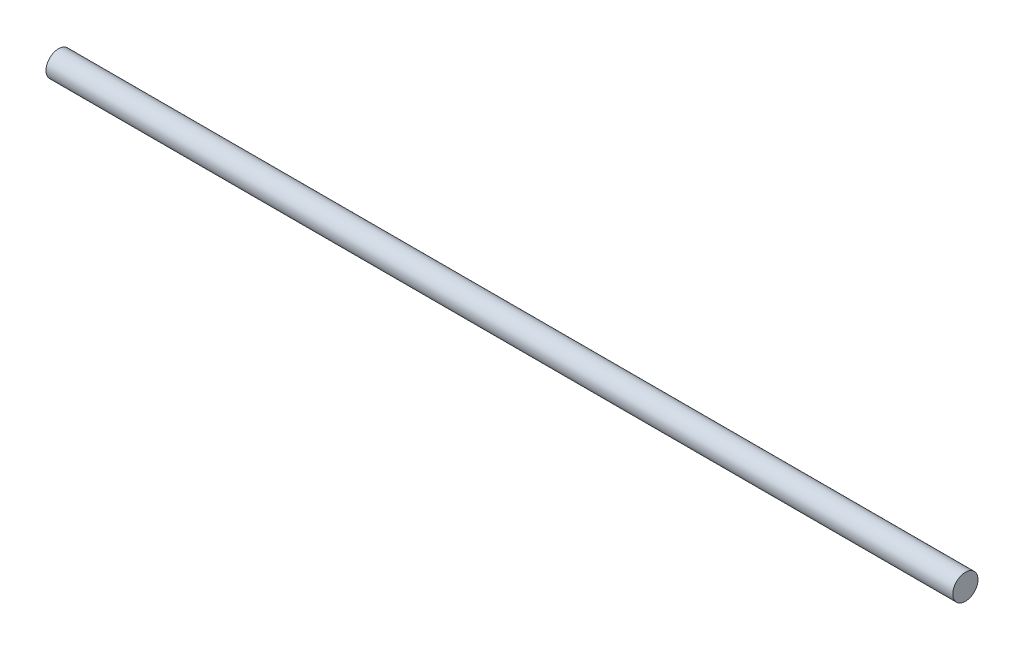
ISO-10303-21;
HEADER;
FILE_DESCRIPTION(('STEP AP214'),'2;1');
FILE_NAME('part.step','',(''),(''),'','','');
FILE_SCHEMA(('AUTOMOTIVE_DESIGN { 1 0 10303 214 1 1 1 1 }'));
ENDSEC;
DATA;
#1=APPLICATION_CONTEXT('core data for automotive mechanical design processes');
#2=APPLICATION_PROTOCOL_DEFINITION('international standard','automotive_design',2000,#1);
#3=PRODUCT_CONTEXT('',#1,'mechanical');
#4=PRODUCT('Part','Part','',(#3));
#5=PRODUCT_RELATED_PRODUCT_CATEGORY('part','',(#4));
#6=PRODUCT_DEFINITION_FORMATION('','',#4);
#7=PRODUCT_DEFINITION_CONTEXT('part definition',#1,'design');
#8=PRODUCT_DEFINITION('design','',#6,#7);
#9=PRODUCT_DEFINITION_SHAPE('','',#8);
#10=(LENGTH_UNIT() NAMED_UNIT(*) SI_UNIT(.MILLI.,.METRE.));
#11=(NAMED_UNIT(*) PLANE_ANGLE_UNIT() SI_UNIT($,.RADIAN.));
#12=(NAMED_UNIT(*) SI_UNIT($,.STERADIAN.) SOLID_ANGLE_UNIT());
#13=UNCERTAINTY_MEASURE_WITH_UNIT(LENGTH_MEASURE(1.E-05),#10,'distance_accuracy_value','');
#14=(GEOMETRIC_REPRESENTATION_CONTEXT(3) GLOBAL_UNCERTAINTY_ASSIGNED_CONTEXT((#13)) GLOBAL_UNIT_ASSIGNED_CONTEXT((#10,
#11,#12)) REPRESENTATION_CONTEXT('',''));
#15=CARTESIAN_POINT('',(0.,0.,0.));
#16=DIRECTION('',(0.,0.,1.));
#17=DIRECTION('',(1.,0.,0.));
#18=AXIS2_PLACEMENT_3D('',#15,#16,#17);
#19=CARTESIAN_POINT('',(228.6,0.,0.));
#20=DIRECTION('',(-1.,0.,0.));
#21=DIRECTION('',(0.,0.,1.));
#22=AXIS2_PLACEMENT_3D('',#19,#20,#21);
#23=CYLINDRICAL_SURFACE('',#22,3.175);
#24=CARTESIAN_POINT('',(228.6,0.,0.));
#25=DIRECTION('',(1.,0.,0.));
#26=DIRECTION('',(0.,0.,-1.));
#27=AXIS2_PLACEMENT_3D('',#24,#25,#26);
#28=CIRCLE('',#27,3.175);
#29=CARTESIAN_POINT('',(228.6,0.,-3.175));
#30=VERTEX_POINT('',#29);
#31=EDGE_CURVE('E10',#30,#30,#28,.T.);
#32=ORIENTED_EDGE('',*,*,#31,.F.);
#33=EDGE_LOOP('',(#32));
#34=FACE_BOUND('',#33,.T.);
#35=CARTESIAN_POINT('',(0.,0.,0.));
#36=DIRECTION('',(1.,0.,0.));
#37=DIRECTION('',(0.,0.,-1.));
#38=AXIS2_PLACEMENT_3D('',#35,#36,#37);
#39=CIRCLE('',#38,3.175);
#40=CARTESIAN_POINT('',(0.,0.,-3.175));
#41=VERTEX_POINT('',#40);
#42=EDGE_CURVE('E34',#41,#41,#39,.T.);
#43=ORIENTED_EDGE('',*,*,#42,.T.);
#44=EDGE_LOOP('',(#43));
#45=FACE_BOUND('',#44,.T.);
#46=ADVANCED_FACE('F31',(#34,#45),#23,.T.);
#47=CARTESIAN_POINT('',(228.6,0.,0.));
#48=DIRECTION('',(1.,0.,0.));
#49=DIRECTION('',(0.,0.,-1.));
#50=AXIS2_PLACEMENT_3D('',#47,#48,#49);
#51=PLANE('',#50);
#52=ORIENTED_EDGE('',*,*,#31,.T.);
#53=EDGE_LOOP('',(#52));
#54=FACE_BOUND('',#53,.T.);
#55=ADVANCED_FACE('F46',(#54),#51,.T.);
#56=CARTESIAN_POINT('',(0.,0.,0.));
#57=DIRECTION('',(1.,0.,0.));
#58=DIRECTION('',(0.,0.,-1.));
#59=AXIS2_PLACEMENT_3D('',#56,#57,#58);
#60=PLANE('',#59);
#61=ORIENTED_EDGE('',*,*,#42,.F.);
#62=EDGE_LOOP('',(#61));
#63=FACE_BOUND('',#62,.T.);
#64=ADVANCED_FACE('F44',(#63),#60,.F.);
#65=CLOSED_SHELL('',(#46,#55,#64));
#66=MANIFOLD_SOLID_BREP('B2',#65);
#67=ADVANCED_BREP_SHAPE_REPRESENTATION('',(#18,#66),#14);
#68=SHAPE_DEFINITION_REPRESENTATION(#9,#67);
ENDSEC;
END-ISO-10303-21;
